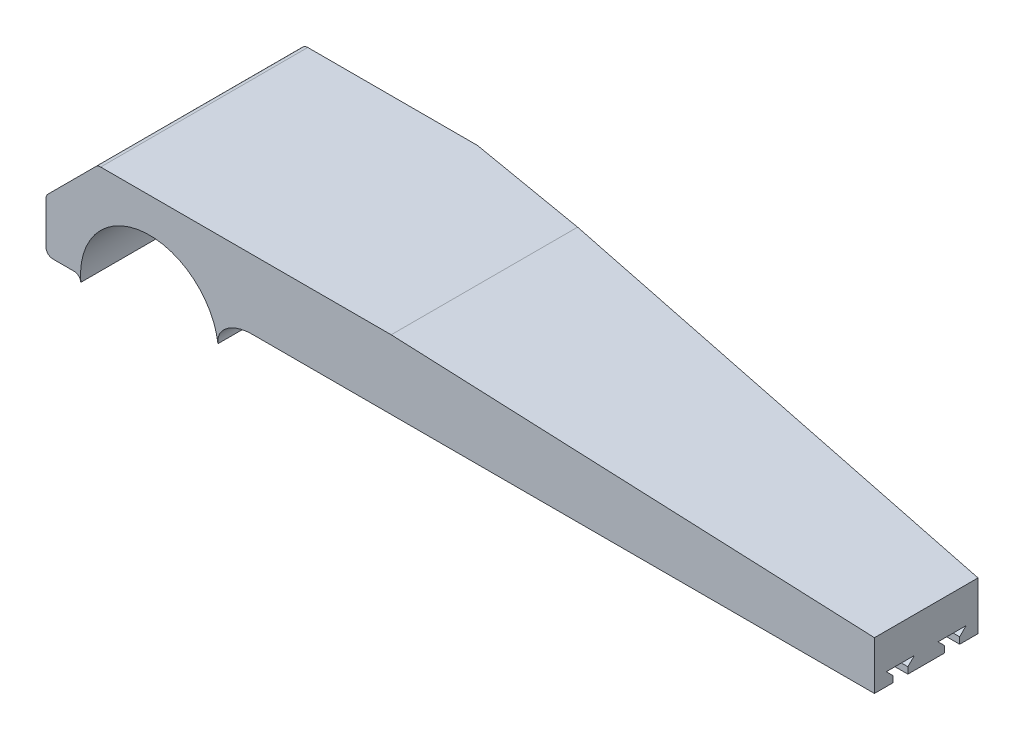
ISO-10303-21;
HEADER;
FILE_DESCRIPTION(('STEP AP214'),'2;1');
FILE_NAME('part.step','',(''),(''),'','','');
FILE_SCHEMA(('AUTOMOTIVE_DESIGN { 1 0 10303 214 1 1 1 1 }'));
ENDSEC;
DATA;
#1=APPLICATION_CONTEXT('core data for automotive mechanical design processes');
#2=APPLICATION_PROTOCOL_DEFINITION('international standard','automotive_design',2000,#1);
#3=PRODUCT_CONTEXT('',#1,'mechanical');
#4=PRODUCT('Part','Part','',(#3));
#5=PRODUCT_RELATED_PRODUCT_CATEGORY('part','',(#4));
#6=PRODUCT_DEFINITION_FORMATION('','',#4);
#7=PRODUCT_DEFINITION_CONTEXT('part definition',#1,'design');
#8=PRODUCT_DEFINITION('design','',#6,#7);
#9=PRODUCT_DEFINITION_SHAPE('','',#8);
#10=(LENGTH_UNIT() NAMED_UNIT(*) SI_UNIT(.MILLI.,.METRE.));
#11=(NAMED_UNIT(*) PLANE_ANGLE_UNIT() SI_UNIT($,.RADIAN.));
#12=(NAMED_UNIT(*) SI_UNIT($,.STERADIAN.) SOLID_ANGLE_UNIT());
#13=UNCERTAINTY_MEASURE_WITH_UNIT(LENGTH_MEASURE(1.E-05),#10,'distance_accuracy_value','');
#14=(GEOMETRIC_REPRESENTATION_CONTEXT(3) GLOBAL_UNCERTAINTY_ASSIGNED_CONTEXT((#13)) GLOBAL_UNIT_ASSIGNED_CONTEXT((#10,
#11,#12)) REPRESENTATION_CONTEXT('',''));
#15=CARTESIAN_POINT('',(0.,0.,0.));
#16=DIRECTION('',(0.,0.,1.));
#17=DIRECTION('',(1.,0.,0.));
#18=AXIS2_PLACEMENT_3D('',#15,#16,#17);
#19=CARTESIAN_POINT('',(130.584621174782,33.1760252329142,596.785052486104));
#20=DIRECTION('',(0.,0.,1.));
#21=DIRECTION('',(1.,0.,0.));
#22=AXIS2_PLACEMENT_3D('',#19,#20,#21);
#23=PLANE('',#22);
#24=CARTESIAN_POINT('',(130.584621174782,33.1760252329142,596.785052486104));
#25=DIRECTION('',(0.,0.,1.));
#26=DIRECTION('',(1.,0.,0.));
#27=AXIS2_PLACEMENT_3D('',#24,#25,#26);
#28=CIRCLE('',#27,160.);
#29=CARTESIAN_POINT('',(289.156021146179,54.5093585662475,596.785052486104));
#30=VERTEX_POINT('',#29);
#31=CARTESIAN_POINT('',(-28.7528500994485,18.6305706874597,596.785052486104));
#32=VERTEX_POINT('',#31);
#33=EDGE_CURVE('E227',#30,#32,#28,.T.);
#34=ORIENTED_EDGE('',*,*,#33,.F.);
#35=CARTESIAN_POINT('',(368.441721131878,113.176025232914,596.785052486104));
#36=CARTESIAN_POINT('',(281.263327029956,113.176025232914,596.785052486104));
#37=CARTESIAN_POINT('',(289.156021146179,54.5093585662475,596.785052486104));
#38=(BOUNDED_CURVE() B_SPLINE_CURVE(2,(#35,#36,#37),.UNSPECIFIED.,.F.,
.F.) B_SPLINE_CURVE_WITH_KNOTS((3,3),(0.,1.),
.UNSPECIFIED.) CURVE() GEOMETRIC_REPRESENTATION_ITEM() RATIONAL_B_SPLINE_CURVE((1.,
0.658280588604383,1.)) REPRESENTATION_ITEM(''));
#39=CARTESIAN_POINT('',(368.441721131878,113.176025232914,596.785052486104));
#40=VERTEX_POINT('',#39);
#41=EDGE_CURVE('E242',#30,#40,#38,.F.);
#42=ORIENTED_EDGE('',*,*,#41,.T.);
#43=DIRECTION('',(1.,0.,0.));
#44=VECTOR('',#43,1.);
#45=CARTESIAN_POINT('',(269.148685780292,113.176025232914,596.785052486104));
#46=LINE('',#45,#44);
#47=CARTESIAN_POINT('',(1810.58462117478,113.176025232914,596.785052486104));
#48=VERTEX_POINT('',#47);
#49=EDGE_CURVE('E386',#40,#48,#46,.T.);
#50=ORIENTED_EDGE('',*,*,#49,.T.);
#51=DIRECTION('',(0.,1.,0.));
#52=VECTOR('',#51,1.);
#53=CARTESIAN_POINT('',(1810.58462117478,113.176025232914,596.785052486104));
#54=LINE('',#53,#52);
#55=CARTESIAN_POINT('',(1810.58462117478,225.176025232914,596.785052486104));
#56=VERTEX_POINT('',#55);
#57=EDGE_CURVE('E389',#48,#56,#54,.T.);
#58=ORIENTED_EDGE('',*,*,#57,.T.);
#59=DIRECTION('',(0.99908289581767,-0.0428178383921858,0.));
#60=VECTOR('',#59,1.);
#61=CARTESIAN_POINT('',(1810.58462117478,225.176025232914,596.785052486104));
#62=LINE('',#61,#60);
#63=CARTESIAN_POINT('',(690.584621174782,273.176025232914,596.785052486104));
#64=VERTEX_POINT('',#63);
#65=EDGE_CURVE('E475',#64,#56,#62,.T.);
#66=ORIENTED_EDGE('',*,*,#65,.F.);
#67=DIRECTION('',(-1.,0.,0.));
#68=VECTOR('',#67,1.);
#69=CARTESIAN_POINT('',(10.5846211747816,273.176025232914,596.785052486104));
#70=LINE('',#69,#68);
#71=CARTESIAN_POINT('',(17.2120381727512,273.176025232914,596.785052486104));
#72=VERTEX_POINT('',#71);
#73=EDGE_CURVE('E399',#64,#72,#70,.T.);
#74=ORIENTED_EDGE('',*,*,#73,.T.);
#75=CARTESIAN_POINT('',(17.2120381727512,257.176025232914,596.785052486104));
#76=DIRECTION('',(0.,0.,1.));
#77=DIRECTION('',(1.,0.,0.));
#78=AXIS2_PLACEMENT_3D('',#75,#76,#77);
#79=CIRCLE('',#78,16.);
#80=CARTESIAN_POINT('',(5.89832967376642,268.489733731899,596.785052486104));
#81=VERTEX_POINT('',#80);
#82=EDGE_CURVE('E330',#72,#81,#79,.T.);
#83=ORIENTED_EDGE('',*,*,#82,.T.);
#84=DIRECTION('',(-0.707106781186548,-0.707106781186548,0.));
#85=VECTOR('',#84,1.);
#86=CARTESIAN_POINT('',(-109.415378825218,153.176025232914,596.785052486104));
#87=LINE('',#86,#85);
#88=CARTESIAN_POINT('',(-104.729087324203,157.862316733929,596.785052486104));
#89=VERTEX_POINT('',#88);
#90=EDGE_CURVE('E372',#81,#89,#87,.T.);
#91=ORIENTED_EDGE('',*,*,#90,.T.);
#92=CARTESIAN_POINT('',(-93.4153788252184,146.548608234945,596.785052486104));
#93=DIRECTION('',(0.,0.,1.));
#94=DIRECTION('',(1.,0.,0.));
#95=AXIS2_PLACEMENT_3D('',#92,#93,#94);
#96=CIRCLE('',#95,16.);
#97=CARTESIAN_POINT('',(-109.415378825218,146.548608234945,596.785052486104));
#98=VERTEX_POINT('',#97);
#99=EDGE_CURVE('E328',#89,#98,#96,.T.);
#100=ORIENTED_EDGE('',*,*,#99,.T.);
#101=DIRECTION('',(0.,-1.,0.));
#102=VECTOR('',#101,1.);
#103=CARTESIAN_POINT('',(-109.415378825218,33.1760252329142,596.785052486104));
#104=LINE('',#103,#102);
#105=CARTESIAN_POINT('',(-109.415378825218,49.1760252329142,596.785052486104));
#106=VERTEX_POINT('',#105);
#107=EDGE_CURVE('E370',#98,#106,#104,.T.);
#108=ORIENTED_EDGE('',*,*,#107,.T.);
#109=CARTESIAN_POINT('',(-93.4153788252184,49.1760252329142,596.785052486104));
#110=DIRECTION('',(0.,0.,1.));
#111=DIRECTION('',(1.,0.,0.));
#112=AXIS2_PLACEMENT_3D('',#109,#110,#111);
#113=CIRCLE('',#112,16.);
#114=CARTESIAN_POINT('',(-93.4153788252184,33.1760252329142,596.785052486104));
#115=VERTEX_POINT('',#114);
#116=EDGE_CURVE('E326',#106,#115,#113,.T.);
#117=ORIENTED_EDGE('',*,*,#116,.T.);
#118=DIRECTION('',(1.,0.,0.));
#119=VECTOR('',#118,1.);
#120=CARTESIAN_POINT('',(-29.4153788252184,33.1760252329142,596.785052486104));
#121=LINE('',#120,#119);
#122=CARTESIAN_POINT('',(-44.6865972268715,33.1760252329142,596.785052486104));
#123=VERTEX_POINT('',#122);
#124=EDGE_CURVE('E320',#115,#123,#121,.T.);
#125=ORIENTED_EDGE('',*,*,#124,.T.);
#126=CARTESIAN_POINT('',(-44.6865972268715,17.1760252329142,596.785052486104));
#127=DIRECTION('',(0.,0.,1.));
#128=DIRECTION('',(1.,0.,0.));
#129=AXIS2_PLACEMENT_3D('',#126,#127,#128);
#130=CIRCLE('',#129,16.);
#131=EDGE_CURVE('E56',#123,#32,#130,.F.);
#132=ORIENTED_EDGE('',*,*,#131,.T.);
#133=EDGE_LOOP('',(#34,#42,#50,#58,#66,#74,#83,#91,#100,#108,#117,#125,#132));
#134=FACE_BOUND('',#133,.T.);
#135=ADVANCED_FACE('F48',(#134),#23,.T.);
#136=CARTESIAN_POINT('',(-29.4153788252184,33.1760252329142,116.785052486104));
#137=DIRECTION('',(0.,-1.,0.));
#138=DIRECTION('',(1.,0.,0.));
#139=AXIS2_PLACEMENT_3D('',#136,#137,#138);
#140=PLANE('',#139);
#141=DIRECTION('',(1.,0.,0.));
#142=VECTOR('',#141,1.);
#143=CARTESIAN_POINT('',(-29.4153788252184,33.1760252329142,116.785052486104));
#144=LINE('',#143,#142);
#145=CARTESIAN_POINT('',(-93.4153788252184,33.1760252329142,116.785052486104));
#146=VERTEX_POINT('',#145);
#147=CARTESIAN_POINT('',(-44.6865972268715,33.1760252329142,116.785052486104));
#148=VERTEX_POINT('',#147);
#149=EDGE_CURVE('E368',#146,#148,#144,.T.);
#150=ORIENTED_EDGE('',*,*,#149,.T.);
#151=DIRECTION('',(0.,0.,-1.));
#152=VECTOR('',#151,1.);
#153=CARTESIAN_POINT('',(-44.6865972268715,33.1760252329142,116.785052486104));
#154=LINE('',#153,#152);
#155=EDGE_CURVE('E350',#148,#123,#154,.F.);
#156=ORIENTED_EDGE('',*,*,#155,.T.);
#157=ORIENTED_EDGE('',*,*,#124,.F.);
#158=DIRECTION('',(0.,0.,1.));
#159=VECTOR('',#158,1.);
#160=CARTESIAN_POINT('',(-93.4153788252184,33.1760252329142,116.785052486104));
#161=LINE('',#160,#159);
#162=EDGE_CURVE('E348',#115,#146,#161,.F.);
#163=ORIENTED_EDGE('',*,*,#162,.T.);
#164=EDGE_LOOP('',(#150,#156,#157,#163));
#165=FACE_BOUND('',#164,.T.);
#166=ADVANCED_FACE('F366',(#165),#140,.T.);
#167=CARTESIAN_POINT('',(-109.415378825218,33.1760252329142,116.785052486104));
#168=DIRECTION('',(-1.,0.,0.));
#169=DIRECTION('',(0.,0.,1.));
#170=AXIS2_PLACEMENT_3D('',#167,#168,#169);
#171=PLANE('',#170);
#172=ORIENTED_EDGE('',*,*,#107,.F.);
#173=DIRECTION('',(0.,0.,1.));
#174=VECTOR('',#173,1.);
#175=CARTESIAN_POINT('',(-109.415378825218,146.548608234945,116.785052486104));
#176=LINE('',#175,#174);
#177=CARTESIAN_POINT('',(-109.415378825218,146.548608234945,116.785052486104));
#178=VERTEX_POINT('',#177);
#179=EDGE_CURVE('E346',#98,#178,#176,.F.);
#180=ORIENTED_EDGE('',*,*,#179,.T.);
#181=DIRECTION('',(0.,-1.,0.));
#182=VECTOR('',#181,1.);
#183=CARTESIAN_POINT('',(-109.415378825218,33.1760252329142,116.785052486104));
#184=LINE('',#183,#182);
#185=CARTESIAN_POINT('',(-109.415378825218,49.1760252329142,116.785052486104));
#186=VERTEX_POINT('',#185);
#187=EDGE_CURVE('E423',#178,#186,#184,.T.);
#188=ORIENTED_EDGE('',*,*,#187,.T.);
#189=DIRECTION('',(0.,0.,1.));
#190=VECTOR('',#189,1.);
#191=CARTESIAN_POINT('',(-109.415378825218,49.1760252329142,116.785052486104));
#192=LINE('',#191,#190);
#193=EDGE_CURVE('E343',#186,#106,#192,.T.);
#194=ORIENTED_EDGE('',*,*,#193,.T.);
#195=EDGE_LOOP('',(#172,#180,#188,#194));
#196=FACE_BOUND('',#195,.T.);
#197=ADVANCED_FACE('F553',(#196),#171,.T.);
#198=CARTESIAN_POINT('',(-109.415378825218,153.176025232914,116.785052486104));
#199=DIRECTION('',(-0.707106781186548,0.707106781186548,0.));
#200=DIRECTION('',(-0.707106781186548,-0.707106781186548,0.));
#201=AXIS2_PLACEMENT_3D('',#198,#199,#200);
#202=PLANE('',#201);
#203=ORIENTED_EDGE('',*,*,#90,.F.);
#204=DIRECTION('',(0.,0.,1.));
#205=VECTOR('',#204,1.);
#206=CARTESIAN_POINT('',(5.89832967376638,268.489733731899,116.785052486104));
#207=LINE('',#206,#205);
#208=CARTESIAN_POINT('',(5.89832967376642,268.489733731899,116.785052486104));
#209=VERTEX_POINT('',#208);
#210=EDGE_CURVE('E335',#81,#209,#207,.F.);
#211=ORIENTED_EDGE('',*,*,#210,.T.);
#212=DIRECTION('',(-0.707106781186548,-0.707106781186548,0.));
#213=VECTOR('',#212,1.);
#214=CARTESIAN_POINT('',(-109.415378825218,153.176025232914,116.785052486104));
#215=LINE('',#214,#213);
#216=CARTESIAN_POINT('',(-104.729087324203,157.862316733929,116.785052486104));
#217=VERTEX_POINT('',#216);
#218=EDGE_CURVE('E415',#209,#217,#215,.T.);
#219=ORIENTED_EDGE('',*,*,#218,.T.);
#220=DIRECTION('',(0.,0.,1.));
#221=VECTOR('',#220,1.);
#222=CARTESIAN_POINT('',(-104.729087324203,157.862316733929,116.785052486104));
#223=LINE('',#222,#221);
#224=EDGE_CURVE('E332',#217,#89,#223,.T.);
#225=ORIENTED_EDGE('',*,*,#224,.T.);
#226=EDGE_LOOP('',(#203,#211,#219,#225));
#227=FACE_BOUND('',#226,.T.);
#228=ADVANCED_FACE('F406',(#227),#202,.T.);
#229=CARTESIAN_POINT('',(10.5846211747816,273.176025232914,116.785052486104));
#230=DIRECTION('',(0.,1.,0.));
#231=DIRECTION('',(0.,0.,1.));
#232=AXIS2_PLACEMENT_3D('',#229,#230,#231);
#233=PLANE('',#232);
#234=DIRECTION('',(-1.,0.,0.));
#235=VECTOR('',#234,1.);
#236=CARTESIAN_POINT('',(10.5846211747816,273.176025232914,116.785052486104));
#237=LINE('',#236,#235);
#238=CARTESIAN_POINT('',(410.584621174782,273.176025232914,116.785052486104));
#239=VERTEX_POINT('',#238);
#240=CARTESIAN_POINT('',(17.2120381727512,273.176025232914,116.785052486104));
#241=VERTEX_POINT('',#240);
#242=EDGE_CURVE('E414',#239,#241,#237,.T.);
#243=ORIENTED_EDGE('',*,*,#242,.T.);
#244=DIRECTION('',(0.,0.,1.));
#245=VECTOR('',#244,1.);
#246=CARTESIAN_POINT('',(17.2120381727512,273.176025232914,116.785052486104));
#247=LINE('',#246,#245);
#248=EDGE_CURVE('E323',#241,#72,#247,.T.);
#249=ORIENTED_EDGE('',*,*,#248,.T.);
#250=ORIENTED_EDGE('',*,*,#73,.F.);
#251=DIRECTION('',(0.,0.,1.));
#252=VECTOR('',#251,1.);
#253=CARTESIAN_POINT('',(690.584621174782,273.176025232914,76.7850524861044));
#254=LINE('',#253,#252);
#255=CARTESIAN_POINT('',(690.584621174782,273.176025232914,164.785052486104));
#256=VERTEX_POINT('',#255);
#257=EDGE_CURVE('E521',#256,#64,#254,.T.);
#258=ORIENTED_EDGE('',*,*,#257,.F.);
#259=DIRECTION('',(0.985622254813267,0.,0.168963815110846));
#260=VECTOR('',#259,1.);
#261=CARTESIAN_POINT('',(22.0041295015065,273.176025232914,50.1712539135429));
#262=LINE('',#261,#260);
#263=EDGE_CURVE('E390',#239,#256,#262,.T.);
#264=ORIENTED_EDGE('',*,*,#263,.F.);
#265=EDGE_LOOP('',(#243,#249,#250,#258,#264));
#266=FACE_BOUND('',#265,.T.);
#267=ADVANCED_FACE('F418',(#266),#233,.T.);
#268=CARTESIAN_POINT('',(1810.58462117478,113.176025232914,116.785052486104));
#269=DIRECTION('',(1.,0.,0.));
#270=DIRECTION('',(0.,0.,-1.));
#271=AXIS2_PLACEMENT_3D('',#268,#269,#270);
#272=PLANE('',#271);
#273=DIRECTION('',(0.,-1.,0.));
#274=VECTOR('',#273,1.);
#275=CARTESIAN_POINT('',(1810.58462117478,113.176025232914,554.285052486104));
#276=LINE('',#275,#274);
#277=CARTESIAN_POINT('',(1810.58462117478,128.176025232914,554.285052486104));
#278=VERTEX_POINT('',#277);
#279=CARTESIAN_POINT('',(1810.58462117478,113.176025232914,554.285052486104));
#280=VERTEX_POINT('',#279);
#281=EDGE_CURVE('E470',#278,#280,#276,.T.);
#282=ORIENTED_EDGE('',*,*,#281,.F.);
#283=DIRECTION('',(0.,-0.707106781186548,-0.707106781186548));
#284=VECTOR('',#283,1.);
#285=CARTESIAN_POINT('',(1810.58462117478,128.176025232914,554.285052486104));
#286=LINE('',#285,#284);
#287=CARTESIAN_POINT('',(1810.58462117478,143.176025232914,569.285052486104));
#288=VERTEX_POINT('',#287);
#289=EDGE_CURVE('E467',#288,#278,#286,.T.);
#290=ORIENTED_EDGE('',*,*,#289,.F.);
#291=DIRECTION('',(0.,0.,1.));
#292=VECTOR('',#291,1.);
#293=CARTESIAN_POINT('',(1810.58462117478,143.176025232914,569.285052486104));
#294=LINE('',#293,#292);
#295=CARTESIAN_POINT('',(1810.58462117478,143.176025232914,504.285052486104));
#296=VERTEX_POINT('',#295);
#297=EDGE_CURVE('E458',#296,#288,#294,.T.);
#298=ORIENTED_EDGE('',*,*,#297,.F.);
#299=DIRECTION('',(0.,0.707106781186548,-0.707106781186548));
#300=VECTOR('',#299,1.);
#301=CARTESIAN_POINT('',(1810.58462117478,143.176025232914,504.285052486104));
#302=LINE('',#301,#300);
#303=CARTESIAN_POINT('',(1810.58462117478,128.176025232914,519.285052486104));
#304=VERTEX_POINT('',#303);
#305=EDGE_CURVE('E455',#304,#296,#302,.T.);
#306=ORIENTED_EDGE('',*,*,#305,.F.);
#307=DIRECTION('',(0.,1.,0.));
#308=VECTOR('',#307,1.);
#309=CARTESIAN_POINT('',(1810.58462117478,128.176025232914,519.285052486104));
#310=LINE('',#309,#308);
#311=CARTESIAN_POINT('',(1810.58462117478,113.176025232914,519.285052486104));
#312=VERTEX_POINT('',#311);
#313=EDGE_CURVE('E452',#312,#304,#310,.T.);
#314=ORIENTED_EDGE('',*,*,#313,.F.);
#315=DIRECTION('',(0.,0.,1.));
#316=VECTOR('',#315,1.);
#317=CARTESIAN_POINT('',(1810.58462117478,113.176025232914,116.785052486104));
#318=LINE('',#317,#316);
#319=CARTESIAN_POINT('',(1810.58462117478,113.176025232914,434.285052486104));
#320=VERTEX_POINT('',#319);
#321=EDGE_CURVE('E380',#320,#312,#318,.T.);
#322=ORIENTED_EDGE('',*,*,#321,.F.);
#323=DIRECTION('',(0.,-1.,0.));
#324=VECTOR('',#323,1.);
#325=CARTESIAN_POINT('',(1810.58462117478,128.176025232914,434.285052486104));
#326=LINE('',#325,#324);
#327=CARTESIAN_POINT('',(1810.58462117478,128.176025232914,434.285052486104));
#328=VERTEX_POINT('',#327);
#329=EDGE_CURVE('E449',#328,#320,#326,.T.);
#330=ORIENTED_EDGE('',*,*,#329,.F.);
#331=DIRECTION('',(0.,-0.707106781186548,-0.707106781186548));
#332=VECTOR('',#331,1.);
#333=CARTESIAN_POINT('',(1810.58462117478,143.176025232914,449.285052486104));
#334=LINE('',#333,#332);
#335=CARTESIAN_POINT('',(1810.58462117478,143.176025232914,449.285052486104));
#336=VERTEX_POINT('',#335);
#337=EDGE_CURVE('E496',#336,#328,#334,.T.);
#338=ORIENTED_EDGE('',*,*,#337,.F.);
#339=DIRECTION('',(0.,0.,1.));
#340=VECTOR('',#339,1.);
#341=CARTESIAN_POINT('',(1810.58462117478,143.176025232914,384.285052486104));
#342=LINE('',#341,#340);
#343=CARTESIAN_POINT('',(1810.58462117478,143.176025232914,384.285052486104));
#344=VERTEX_POINT('',#343);
#345=EDGE_CURVE('E499',#344,#336,#342,.T.);
#346=ORIENTED_EDGE('',*,*,#345,.F.);
#347=DIRECTION('',(0.,0.707106781186548,-0.707106781186548));
#348=VECTOR('',#347,1.);
#349=CARTESIAN_POINT('',(1810.58462117478,128.176025232914,399.285052486104));
#350=LINE('',#349,#348);
#351=CARTESIAN_POINT('',(1810.58462117478,128.176025232914,399.285052486104));
#352=VERTEX_POINT('',#351);
#353=EDGE_CURVE('E502',#352,#344,#350,.T.);
#354=ORIENTED_EDGE('',*,*,#353,.F.);
#355=DIRECTION('',(0.,1.,0.));
#356=VECTOR('',#355,1.);
#357=CARTESIAN_POINT('',(1810.58462117478,113.176025232914,399.285052486104));
#358=LINE('',#357,#356);
#359=CARTESIAN_POINT('',(1810.58462117478,113.176025232914,399.285052486104));
#360=VERTEX_POINT('',#359);
#361=EDGE_CURVE('E460',#360,#352,#358,.T.);
#362=ORIENTED_EDGE('',*,*,#361,.F.);
#363=CARTESIAN_POINT('',(1810.58462117478,113.176025232914,356.785052486104));
#364=VERTEX_POINT('',#363);
#365=EDGE_CURVE('E376',#364,#360,#318,.T.);
#366=ORIENTED_EDGE('',*,*,#365,.F.);
#367=DIRECTION('',(0.,-1.,0.));
#368=VECTOR('',#367,1.);
#369=CARTESIAN_POINT('',(1810.58462117478,593.176025232914,356.785052486104));
#370=LINE('',#369,#368);
#371=CARTESIAN_POINT('',(1810.58462117478,225.176025232914,356.785052486104));
#372=VERTEX_POINT('',#371);
#373=EDGE_CURVE('E529',#372,#364,#370,.T.);
#374=ORIENTED_EDGE('',*,*,#373,.F.);
#375=DIRECTION('',(0.,0.,1.));
#376=VECTOR('',#375,1.);
#377=CARTESIAN_POINT('',(1810.58462117478,225.176025232914,76.7850524861044));
#378=LINE('',#377,#376);
#379=EDGE_CURVE('E522',#372,#56,#378,.T.);
#380=ORIENTED_EDGE('',*,*,#379,.T.);
#381=ORIENTED_EDGE('',*,*,#57,.F.);
#382=EDGE_CURVE('E381',#280,#48,#318,.T.);
#383=ORIENTED_EDGE('',*,*,#382,.F.);
#384=EDGE_LOOP('',(#282,#290,#298,#306,#314,#322,#330,#338,#346,#354,#362,#366,#374,#380,#381,#383));
#385=FACE_BOUND('',#384,.T.);
#386=ADVANCED_FACE('F447',(#385),#272,.T.);
#387=CARTESIAN_POINT('',(269.148685780292,113.176025232914,116.785052486104));
#388=DIRECTION('',(0.,-1.,0.));
#389=DIRECTION('',(1.,0.,0.));
#390=AXIS2_PLACEMENT_3D('',#387,#388,#389);
#391=PLANE('',#390);
#392=DIRECTION('',(1.,0.,0.));
#393=VECTOR('',#392,1.);
#394=CARTESIAN_POINT('',(410.584621174782,113.176025232914,554.285052486104));
#395=LINE('',#394,#393);
#396=CARTESIAN_POINT('',(410.584621174782,113.176025232914,554.285052486104));
#397=VERTEX_POINT('',#396);
#398=EDGE_CURVE('E473',#397,#280,#395,.T.);
#399=ORIENTED_EDGE('',*,*,#398,.T.);
#400=ORIENTED_EDGE('',*,*,#382,.T.);
#401=ORIENTED_EDGE('',*,*,#49,.F.);
#402=CARTESIAN_POINT('',(368.441721131878,113.176025232914,92.7850524861043));
#403=CARTESIAN_POINT('',(368.441721131878,113.176025232914,268.785052486104));
#404=CARTESIAN_POINT('',(368.441721131878,113.176025232914,444.785052486105));
#405=CARTESIAN_POINT('',(368.441721131878,113.176025232914,620.785052486105));
#406=(BOUNDED_CURVE() B_SPLINE_CURVE(3,(#402,#403,#404,#405),.UNSPECIFIED.,.F.,
.F.) B_SPLINE_CURVE_WITH_KNOTS((4,4),(-0.03,0.63),
.UNSPECIFIED.) CURVE() GEOMETRIC_REPRESENTATION_ITEM() RATIONAL_B_SPLINE_CURVE((1.,1.,1.,1.)) REPRESENTATION_ITEM(''));
#407=CARTESIAN_POINT('',(368.441721131878,113.176025232914,116.785052486104));
#408=VERTEX_POINT('',#407);
#409=EDGE_CURVE('E236',#40,#408,#406,.F.);
#410=ORIENTED_EDGE('',*,*,#409,.T.);
#411=DIRECTION('',(1.,0.,0.));
#412=VECTOR('',#411,1.);
#413=CARTESIAN_POINT('',(269.148685780292,113.176025232914,116.785052486104));
#414=LINE('',#413,#412);
#415=CARTESIAN_POINT('',(410.584621174782,113.176025232914,116.785052486104));
#416=VERTEX_POINT('',#415);
#417=EDGE_CURVE('E319',#408,#416,#414,.T.);
#418=ORIENTED_EDGE('',*,*,#417,.T.);
#419=DIRECTION('',(-0.985622254813267,0.,-0.168963815110846));
#420=VECTOR('',#419,1.);
#421=CARTESIAN_POINT('',(410.584621174782,113.176025232914,116.785052486104));
#422=LINE('',#421,#420);
#423=EDGE_CURVE('E525',#364,#416,#422,.T.);
#424=ORIENTED_EDGE('',*,*,#423,.F.);
#425=ORIENTED_EDGE('',*,*,#365,.T.);
#426=DIRECTION('',(1.,0.,0.));
#427=VECTOR('',#426,1.);
#428=CARTESIAN_POINT('',(410.584621174782,113.176025232914,399.285052486104));
#429=LINE('',#428,#427);
#430=CARTESIAN_POINT('',(410.584621174782,113.176025232914,399.285052486104));
#431=VERTEX_POINT('',#430);
#432=EDGE_CURVE('E487',#431,#360,#429,.T.);
#433=ORIENTED_EDGE('',*,*,#432,.F.);
#434=DIRECTION('',(0.,0.,-1.));
#435=VECTOR('',#434,1.);
#436=CARTESIAN_POINT('',(410.584621174782,113.176025232914,434.285052486104));
#437=LINE('',#436,#435);
#438=CARTESIAN_POINT('',(410.584621174782,113.176025232914,434.285052486104));
#439=VERTEX_POINT('',#438);
#440=EDGE_CURVE('E517',#439,#431,#437,.T.);
#441=ORIENTED_EDGE('',*,*,#440,.F.);
#442=DIRECTION('',(1.,0.,0.));
#443=VECTOR('',#442,1.);
#444=CARTESIAN_POINT('',(410.584621174782,113.176025232914,434.285052486104));
#445=LINE('',#444,#443);
#446=EDGE_CURVE('E442',#439,#320,#445,.T.);
#447=ORIENTED_EDGE('',*,*,#446,.T.);
#448=ORIENTED_EDGE('',*,*,#321,.T.);
#449=DIRECTION('',(1.,0.,0.));
#450=VECTOR('',#449,1.);
#451=CARTESIAN_POINT('',(410.584621174782,113.176025232914,519.285052486104));
#452=LINE('',#451,#450);
#453=CARTESIAN_POINT('',(410.584621174782,113.176025232914,519.285052486104));
#454=VERTEX_POINT('',#453);
#455=EDGE_CURVE('E440',#454,#312,#452,.T.);
#456=ORIENTED_EDGE('',*,*,#455,.F.);
#457=DIRECTION('',(0.,0.,-1.));
#458=VECTOR('',#457,1.);
#459=CARTESIAN_POINT('',(410.584621174782,113.176025232914,519.285052486104));
#460=LINE('',#459,#458);
#461=EDGE_CURVE('E472',#397,#454,#460,.T.);
#462=ORIENTED_EDGE('',*,*,#461,.F.);
#463=EDGE_LOOP('',(#399,#400,#401,#410,#418,#424,#425,#433,#441,#447,#448,#456,#462));
#464=FACE_BOUND('',#463,.T.);
#465=ADVANCED_FACE('F438',(#464),#391,.T.);
#466=CARTESIAN_POINT('',(130.584621174782,33.1760252329142,116.785052486104));
#467=DIRECTION('',(0.,0.,1.));
#468=DIRECTION('',(1.,0.,0.));
#469=AXIS2_PLACEMENT_3D('',#466,#467,#468);
#470=PLANE('',#469);
#471=ORIENTED_EDGE('',*,*,#218,.F.);
#472=CARTESIAN_POINT('',(17.2120381727512,257.176025232914,116.785052486104));
#473=DIRECTION('',(0.,0.,1.));
#474=DIRECTION('',(1.,0.,0.));
#475=AXIS2_PLACEMENT_3D('',#472,#473,#474);
#476=CIRCLE('',#475,16.);
#477=EDGE_CURVE('E341',#209,#241,#476,.F.);
#478=ORIENTED_EDGE('',*,*,#477,.T.);
#479=ORIENTED_EDGE('',*,*,#242,.F.);
#480=DIRECTION('',(0.,-1.,0.));
#481=VECTOR('',#480,1.);
#482=CARTESIAN_POINT('',(410.584621174782,33.1760252329142,116.785052486104));
#483=LINE('',#482,#481);
#484=EDGE_CURVE('E379',#239,#416,#483,.T.);
#485=ORIENTED_EDGE('',*,*,#484,.T.);
#486=ORIENTED_EDGE('',*,*,#417,.F.);
#487=CARTESIAN_POINT('',(289.156021146179,54.5093585662476,116.785052486104));
#488=CARTESIAN_POINT('',(281.263327029956,113.176025232914,116.785052486104));
#489=CARTESIAN_POINT('',(368.441721131878,113.176025232914,116.785052486104));
#490=(BOUNDED_CURVE() B_SPLINE_CURVE(2,(#487,#488,#489),.UNSPECIFIED.,.F.,
.F.) B_SPLINE_CURVE_WITH_KNOTS((3,3),(0.,1.),
.UNSPECIFIED.) CURVE() GEOMETRIC_REPRESENTATION_ITEM() RATIONAL_B_SPLINE_CURVE((1.,
0.658280588604383,1.)) REPRESENTATION_ITEM(''));
#491=CARTESIAN_POINT('',(289.156021146179,54.5093585662476,116.785052486104));
#492=VERTEX_POINT('',#491);
#493=EDGE_CURVE('E253',#408,#492,#490,.F.);
#494=ORIENTED_EDGE('',*,*,#493,.T.);
#495=CARTESIAN_POINT('',(130.584621174782,33.1760252329142,116.785052486104));
#496=DIRECTION('',(0.,0.,-1.));
#497=DIRECTION('',(1.,0.,0.));
#498=AXIS2_PLACEMENT_3D('',#495,#496,#497);
#499=CIRCLE('',#498,160.);
#500=CARTESIAN_POINT('',(-28.7528500994485,18.6305706874597,116.785052486104));
#501=VERTEX_POINT('',#500);
#502=EDGE_CURVE('E230',#501,#492,#499,.T.);
#503=ORIENTED_EDGE('',*,*,#502,.F.);
#504=CARTESIAN_POINT('',(-44.6865972268715,17.1760252329142,116.785052486104));
#505=DIRECTION('',(0.,0.,1.));
#506=DIRECTION('',(1.,0.,0.));
#507=AXIS2_PLACEMENT_3D('',#504,#505,#506);
#508=CIRCLE('',#507,16.);
#509=EDGE_CURVE('E12',#501,#148,#508,.T.);
#510=ORIENTED_EDGE('',*,*,#509,.T.);
#511=ORIENTED_EDGE('',*,*,#149,.F.);
#512=CARTESIAN_POINT('',(-93.4153788252184,49.1760252329142,116.785052486104));
#513=DIRECTION('',(0.,0.,1.));
#514=DIRECTION('',(1.,0.,0.));
#515=AXIS2_PLACEMENT_3D('',#512,#513,#514);
#516=CIRCLE('',#515,16.);
#517=EDGE_CURVE('E337',#146,#186,#516,.F.);
#518=ORIENTED_EDGE('',*,*,#517,.T.);
#519=ORIENTED_EDGE('',*,*,#187,.F.);
#520=CARTESIAN_POINT('',(-93.4153788252184,146.548608234945,116.785052486104));
#521=DIRECTION('',(0.,0.,1.));
#522=DIRECTION('',(1.,0.,0.));
#523=AXIS2_PLACEMENT_3D('',#520,#521,#522);
#524=CIRCLE('',#523,16.);
#525=EDGE_CURVE('E339',#178,#217,#524,.F.);
#526=ORIENTED_EDGE('',*,*,#525,.T.);
#527=EDGE_LOOP('',(#471,#478,#479,#485,#486,#494,#503,#510,#511,#518,#519,#526));
#528=FACE_BOUND('',#527,.T.);
#529=ADVANCED_FACE('F358',(#528),#470,.F.);
#530=CARTESIAN_POINT('',(410.584621174782,593.176025232914,116.785052486104));
#531=DIRECTION('',(-0.168963815110846,0.,0.985622254813267));
#532=DIRECTION('',(0.985622254813267,0.,0.168963815110846));
#533=AXIS2_PLACEMENT_3D('',#530,#531,#532);
#534=PLANE('',#533);
#535=ORIENTED_EDGE('',*,*,#263,.T.);
#536=DIRECTION('',(0.984744107800003,-0.0422033189057144,0.168813275622858));
#537=VECTOR('',#536,1.);
#538=CARTESIAN_POINT('',(397.784304531204,285.724610231925,114.590712490062));
#539=LINE('',#538,#537);
#540=EDGE_CURVE('E237',#256,#372,#539,.T.);
#541=ORIENTED_EDGE('',*,*,#540,.T.);
#542=ORIENTED_EDGE('',*,*,#373,.T.);
#543=ORIENTED_EDGE('',*,*,#423,.T.);
#544=ORIENTED_EDGE('',*,*,#484,.F.);
#545=EDGE_LOOP('',(#535,#541,#542,#543,#544));
#546=FACE_BOUND('',#545,.T.);
#547=ADVANCED_FACE('F531',(#546),#534,.F.);
#548=CARTESIAN_POINT('',(1810.58462117478,225.176025232914,76.7850524861044));
#549=DIRECTION('',(-0.0428178383921858,-0.99908289581767,0.));
#550=DIRECTION('',(0.99908289581767,-0.0428178383921859,0.));
#551=AXIS2_PLACEMENT_3D('',#548,#549,#550);
#552=PLANE('',#551);
#553=ORIENTED_EDGE('',*,*,#257,.T.);
#554=ORIENTED_EDGE('',*,*,#65,.T.);
#555=ORIENTED_EDGE('',*,*,#379,.F.);
#556=ORIENTED_EDGE('',*,*,#540,.F.);
#557=EDGE_LOOP('',(#553,#554,#555,#556));
#558=FACE_BOUND('',#557,.T.);
#559=ADVANCED_FACE('F275',(#558),#552,.F.);
#560=CARTESIAN_POINT('',(368.441721131878,113.176025232914,620.785052486105));
#561=CARTESIAN_POINT('',(368.441721131878,113.176025232914,444.785052486105));
#562=CARTESIAN_POINT('',(368.441721131878,113.176025232914,268.785052486104));
#563=CARTESIAN_POINT('',(368.441721131878,113.176025232914,92.7850524861043));
#564=CARTESIAN_POINT('',(281.263327029956,113.176025232914,620.785052486104));
#565=CARTESIAN_POINT('',(281.263327029956,113.176025232914,444.785052486105));
#566=CARTESIAN_POINT('',(281.263327029956,113.176025232914,268.785052486104));
#567=CARTESIAN_POINT('',(281.263327029956,113.176025232914,92.7850524861043));
#568=CARTESIAN_POINT('',(289.156021146179,54.5093585662476,620.785052486105));
#569=CARTESIAN_POINT('',(289.156021146179,54.5093585662476,444.785052486105));
#570=CARTESIAN_POINT('',(289.156021146179,54.5093585662476,268.785052486104));
#571=CARTESIAN_POINT('',(289.156021146179,54.5093585662476,92.7850524861043));
#572=(BOUNDED_SURFACE() B_SPLINE_SURFACE(2,3,((#560,#561,#562,#563),(#564,#565,#566,#567),(#568,
#569,#570,#571)),.UNSPECIFIED.,.F.,.F.,.F.) B_SPLINE_SURFACE_WITH_KNOTS((3,3),(4,4),(0.,1.),
(-0.03,0.63),.UNSPECIFIED.) GEOMETRIC_REPRESENTATION_ITEM() RATIONAL_B_SPLINE_SURFACE(((1.,1.,
1.,1.),(0.658280588604383,0.658280588604383,0.658280588604383,0.658280588604383),(1.,1.,1.,1.))) REPRESENTATION_ITEM('') SURFACE());
#573=CARTESIAN_POINT('',(289.156021146179,54.5093585662476,620.785052486105));
#574=CARTESIAN_POINT('',(289.156021146179,54.5093585662476,444.785052486105));
#575=CARTESIAN_POINT('',(289.156021146179,54.5093585662476,268.785052486104));
#576=CARTESIAN_POINT('',(289.156021146179,54.5093585662476,92.7850524861043));
#577=(BOUNDED_CURVE() B_SPLINE_CURVE(3,(#573,#574,#575,#576),.UNSPECIFIED.,.F.,
.F.) B_SPLINE_CURVE_WITH_KNOTS((4,4),(-0.03,0.63),
.UNSPECIFIED.) CURVE() GEOMETRIC_REPRESENTATION_ITEM() RATIONAL_B_SPLINE_CURVE((1.,1.,1.,1.)) REPRESENTATION_ITEM(''));
#578=EDGE_CURVE('E223',#492,#30,#577,.F.);
#579=ORIENTED_EDGE('',*,*,#493,.F.);
#580=ORIENTED_EDGE('',*,*,#409,.F.);
#581=ORIENTED_EDGE('',*,*,#41,.F.);
#582=ORIENTED_EDGE('',*,*,#578,.F.);
#583=EDGE_LOOP('',(#579,#580,#581,#582));
#584=FACE_BOUND('',#583,.T.);
#585=ADVANCED_FACE('F251',(#584),#572,.T.);
#586=CARTESIAN_POINT('',(17.2120381727512,257.176025232914,116.785052486104));
#587=DIRECTION('',(0.,0.,1.));
#588=DIRECTION('',(1.,0.,0.));
#589=AXIS2_PLACEMENT_3D('',#586,#587,#588);
#590=CYLINDRICAL_SURFACE('',#589,16.);
#591=ORIENTED_EDGE('',*,*,#477,.F.);
#592=ORIENTED_EDGE('',*,*,#210,.F.);
#593=ORIENTED_EDGE('',*,*,#82,.F.);
#594=ORIENTED_EDGE('',*,*,#248,.F.);
#595=EDGE_LOOP('',(#591,#592,#593,#594));
#596=FACE_BOUND('',#595,.T.);
#597=ADVANCED_FACE('F274',(#596),#590,.T.);
#598=CARTESIAN_POINT('',(-93.4153788252184,146.548608234945,116.785052486104));
#599=DIRECTION('',(0.,0.,1.));
#600=DIRECTION('',(1.,0.,0.));
#601=AXIS2_PLACEMENT_3D('',#598,#599,#600);
#602=CYLINDRICAL_SURFACE('',#601,16.);
#603=ORIENTED_EDGE('',*,*,#525,.F.);
#604=ORIENTED_EDGE('',*,*,#179,.F.);
#605=ORIENTED_EDGE('',*,*,#99,.F.);
#606=ORIENTED_EDGE('',*,*,#224,.F.);
#607=EDGE_LOOP('',(#603,#604,#605,#606));
#608=FACE_BOUND('',#607,.T.);
#609=ADVANCED_FACE('F698',(#608),#602,.T.);
#610=CARTESIAN_POINT('',(-44.6865972268715,17.1760252329142,596.785052486104));
#611=DIRECTION('',(0.,0.,-1.));
#612=DIRECTION('',(-1.,0.,0.));
#613=AXIS2_PLACEMENT_3D('',#610,#611,#612);
#614=CYLINDRICAL_SURFACE('',#613,16.);
#615=ORIENTED_EDGE('',*,*,#509,.F.);
#616=DIRECTION('',(0.,0.,-1.));
#617=VECTOR('',#616,1.);
#618=CARTESIAN_POINT('',(-28.7528500994485,18.6305706874597,596.785052486104));
#619=LINE('',#618,#617);
#620=EDGE_CURVE('E353',#32,#501,#619,.T.);
#621=ORIENTED_EDGE('',*,*,#620,.F.);
#622=ORIENTED_EDGE('',*,*,#131,.F.);
#623=ORIENTED_EDGE('',*,*,#155,.F.);
#624=EDGE_LOOP('',(#615,#621,#622,#623));
#625=FACE_BOUND('',#624,.T.);
#626=ADVANCED_FACE('F363',(#625),#614,.F.);
#627=CARTESIAN_POINT('',(-93.4153788252184,49.1760252329142,116.785052486104));
#628=DIRECTION('',(0.,0.,1.));
#629=DIRECTION('',(1.,0.,0.));
#630=AXIS2_PLACEMENT_3D('',#627,#628,#629);
#631=CYLINDRICAL_SURFACE('',#630,16.);
#632=ORIENTED_EDGE('',*,*,#517,.F.);
#633=ORIENTED_EDGE('',*,*,#162,.F.);
#634=ORIENTED_EDGE('',*,*,#116,.F.);
#635=ORIENTED_EDGE('',*,*,#193,.F.);
#636=EDGE_LOOP('',(#632,#633,#634,#635));
#637=FACE_BOUND('',#636,.T.);
#638=ADVANCED_FACE('F50',(#637),#631,.T.);
#639=CARTESIAN_POINT('',(410.584621174782,128.176025232914,434.285052486104));
#640=DIRECTION('',(0.,0.,1.));
#641=DIRECTION('',(1.,0.,0.));
#642=AXIS2_PLACEMENT_3D('',#639,#640,#641);
#643=PLANE('',#642);
#644=ORIENTED_EDGE('',*,*,#329,.T.);
#645=ORIENTED_EDGE('',*,*,#446,.F.);
#646=DIRECTION('',(0.,-1.,0.));
#647=VECTOR('',#646,1.);
#648=CARTESIAN_POINT('',(410.584621174782,128.176025232914,434.285052486104));
#649=LINE('',#648,#647);
#650=CARTESIAN_POINT('',(410.584621174782,128.176025232914,434.285052486104));
#651=VERTEX_POINT('',#650);
#652=EDGE_CURVE('E71',#651,#439,#649,.T.);
#653=ORIENTED_EDGE('',*,*,#652,.F.);
#654=DIRECTION('',(1.,0.,0.));
#655=VECTOR('',#654,1.);
#656=CARTESIAN_POINT('',(410.584621174782,128.176025232914,434.285052486104));
#657=LINE('',#656,#655);
#658=EDGE_CURVE('E247',#651,#328,#657,.T.);
#659=ORIENTED_EDGE('',*,*,#658,.T.);
#660=EDGE_LOOP('',(#644,#645,#653,#659));
#661=FACE_BOUND('',#660,.T.);
#662=ADVANCED_FACE('F574',(#661),#643,.F.);
#663=CARTESIAN_POINT('',(410.584621174782,143.176025232914,449.285052486104));
#664=DIRECTION('',(0.,-0.707106781186547,0.707106781186547));
#665=DIRECTION('',(0.,-0.707106781186548,-0.707106781186548));
#666=AXIS2_PLACEMENT_3D('',#663,#664,#665);
#667=PLANE('',#666);
#668=ORIENTED_EDGE('',*,*,#337,.T.);
#669=ORIENTED_EDGE('',*,*,#658,.F.);
#670=DIRECTION('',(0.,-0.707106781186548,-0.707106781186548));
#671=VECTOR('',#670,1.);
#672=CARTESIAN_POINT('',(410.584621174782,143.176025232914,449.285052486104));
#673=LINE('',#672,#671);
#674=CARTESIAN_POINT('',(410.584621174782,143.176025232914,449.285052486104));
#675=VERTEX_POINT('',#674);
#676=EDGE_CURVE('E486',#675,#651,#673,.T.);
#677=ORIENTED_EDGE('',*,*,#676,.F.);
#678=DIRECTION('',(1.,0.,0.));
#679=VECTOR('',#678,1.);
#680=CARTESIAN_POINT('',(410.584621174782,143.176025232914,449.285052486104));
#681=LINE('',#680,#679);
#682=EDGE_CURVE('E493',#675,#336,#681,.T.);
#683=ORIENTED_EDGE('',*,*,#682,.T.);
#684=EDGE_LOOP('',(#668,#669,#677,#683));
#685=FACE_BOUND('',#684,.T.);
#686=ADVANCED_FACE('F570',(#685),#667,.F.);
#687=CARTESIAN_POINT('',(410.584621174782,143.176025232914,384.285052486104));
#688=DIRECTION('',(0.,1.,0.));
#689=DIRECTION('',(0.,0.,1.));
#690=AXIS2_PLACEMENT_3D('',#687,#688,#689);
#691=PLANE('',#690);
#692=ORIENTED_EDGE('',*,*,#345,.T.);
#693=ORIENTED_EDGE('',*,*,#682,.F.);
#694=DIRECTION('',(0.,0.,1.));
#695=VECTOR('',#694,1.);
#696=CARTESIAN_POINT('',(410.584621174782,143.176025232914,384.285052486104));
#697=LINE('',#696,#695);
#698=CARTESIAN_POINT('',(410.584621174782,143.176025232914,384.285052486104));
#699=VERTEX_POINT('',#698);
#700=EDGE_CURVE('E508',#699,#675,#697,.T.);
#701=ORIENTED_EDGE('',*,*,#700,.F.);
#702=DIRECTION('',(1.,0.,0.));
#703=VECTOR('',#702,1.);
#704=CARTESIAN_POINT('',(410.584621174782,143.176025232914,384.285052486104));
#705=LINE('',#704,#703);
#706=EDGE_CURVE('E491',#699,#344,#705,.T.);
#707=ORIENTED_EDGE('',*,*,#706,.T.);
#708=EDGE_LOOP('',(#692,#693,#701,#707));
#709=FACE_BOUND('',#708,.T.);
#710=ADVANCED_FACE('F573',(#709),#691,.F.);
#711=CARTESIAN_POINT('',(410.584621174782,128.176025232914,399.285052486104));
#712=DIRECTION('',(0.,-0.707106781186547,-0.707106781186547));
#713=DIRECTION('',(0.,0.707106781186548,-0.707106781186548));
#714=AXIS2_PLACEMENT_3D('',#711,#712,#713);
#715=PLANE('',#714);
#716=ORIENTED_EDGE('',*,*,#353,.T.);
#717=ORIENTED_EDGE('',*,*,#706,.F.);
#718=DIRECTION('',(0.,0.707106781186548,-0.707106781186548));
#719=VECTOR('',#718,1.);
#720=CARTESIAN_POINT('',(410.584621174782,128.176025232914,399.285052486104));
#721=LINE('',#720,#719);
#722=CARTESIAN_POINT('',(410.584621174782,128.176025232914,399.285052486104));
#723=VERTEX_POINT('',#722);
#724=EDGE_CURVE('E511',#723,#699,#721,.T.);
#725=ORIENTED_EDGE('',*,*,#724,.F.);
#726=DIRECTION('',(1.,0.,0.));
#727=VECTOR('',#726,1.);
#728=CARTESIAN_POINT('',(410.584621174782,128.176025232914,399.285052486104));
#729=LINE('',#728,#727);
#730=EDGE_CURVE('E489',#723,#352,#729,.T.);
#731=ORIENTED_EDGE('',*,*,#730,.T.);
#732=EDGE_LOOP('',(#716,#717,#725,#731));
#733=FACE_BOUND('',#732,.T.);
#734=ADVANCED_FACE('F578',(#733),#715,.F.);
#735=CARTESIAN_POINT('',(410.584621174782,113.176025232914,399.285052486104));
#736=DIRECTION('',(0.,0.,-1.));
#737=DIRECTION('',(-1.,0.,0.));
#738=AXIS2_PLACEMENT_3D('',#735,#736,#737);
#739=PLANE('',#738);
#740=ORIENTED_EDGE('',*,*,#361,.T.);
#741=ORIENTED_EDGE('',*,*,#730,.F.);
#742=DIRECTION('',(0.,1.,0.));
#743=VECTOR('',#742,1.);
#744=CARTESIAN_POINT('',(410.584621174782,113.176025232914,399.285052486104));
#745=LINE('',#744,#743);
#746=EDGE_CURVE('E514',#431,#723,#745,.T.);
#747=ORIENTED_EDGE('',*,*,#746,.F.);
#748=ORIENTED_EDGE('',*,*,#432,.T.);
#749=EDGE_LOOP('',(#740,#741,#747,#748));
#750=FACE_BOUND('',#749,.T.);
#751=ADVANCED_FACE('F569',(#750),#739,.F.);
#752=CARTESIAN_POINT('',(410.584621174782,0.,0.));
#753=DIRECTION('',(1.,0.,0.));
#754=DIRECTION('',(0.,0.,-1.));
#755=AXIS2_PLACEMENT_3D('',#752,#753,#754);
#756=PLANE('',#755);
#757=ORIENTED_EDGE('',*,*,#652,.T.);
#758=ORIENTED_EDGE('',*,*,#440,.T.);
#759=ORIENTED_EDGE('',*,*,#746,.T.);
#760=ORIENTED_EDGE('',*,*,#724,.T.);
#761=ORIENTED_EDGE('',*,*,#700,.T.);
#762=ORIENTED_EDGE('',*,*,#676,.T.);
#763=EDGE_LOOP('',(#757,#758,#759,#760,#761,#762));
#764=FACE_BOUND('',#763,.T.);
#765=ADVANCED_FACE('F565',(#764),#756,.T.);
#766=CARTESIAN_POINT('',(410.584621174782,113.176025232914,554.285052486104));
#767=DIRECTION('',(0.,0.,1.));
#768=DIRECTION('',(1.,0.,0.));
#769=AXIS2_PLACEMENT_3D('',#766,#767,#768);
#770=PLANE('',#769);
#771=ORIENTED_EDGE('',*,*,#281,.T.);
#772=ORIENTED_EDGE('',*,*,#398,.F.);
#773=DIRECTION('',(0.,-1.,0.));
#774=VECTOR('',#773,1.);
#775=CARTESIAN_POINT('',(410.584621174782,113.176025232914,554.285052486104));
#776=LINE('',#775,#774);
#777=CARTESIAN_POINT('',(410.584621174782,128.176025232914,554.285052486104));
#778=VERTEX_POINT('',#777);
#779=EDGE_CURVE('E63',#778,#397,#776,.T.);
#780=ORIENTED_EDGE('',*,*,#779,.F.);
#781=DIRECTION('',(1.,0.,0.));
#782=VECTOR('',#781,1.);
#783=CARTESIAN_POINT('',(410.584621174782,128.176025232914,554.285052486104));
#784=LINE('',#783,#782);
#785=EDGE_CURVE('E476',#778,#278,#784,.T.);
#786=ORIENTED_EDGE('',*,*,#785,.T.);
#787=EDGE_LOOP('',(#771,#772,#780,#786));
#788=FACE_BOUND('',#787,.T.);
#789=ADVANCED_FACE('F568',(#788),#770,.F.);
#790=CARTESIAN_POINT('',(410.584621174782,128.176025232914,554.285052486104));
#791=DIRECTION('',(0.,-0.707106781186547,0.707106781186547));
#792=DIRECTION('',(0.,-0.707106781186548,-0.707106781186548));
#793=AXIS2_PLACEMENT_3D('',#790,#791,#792);
#794=PLANE('',#793);
#795=ORIENTED_EDGE('',*,*,#289,.T.);
#796=ORIENTED_EDGE('',*,*,#785,.F.);
#797=DIRECTION('',(0.,-0.707106781186548,-0.707106781186548));
#798=VECTOR('',#797,1.);
#799=CARTESIAN_POINT('',(410.584621174782,128.176025232914,554.285052486104));
#800=LINE('',#799,#798);
#801=CARTESIAN_POINT('',(410.584621174782,143.176025232914,569.285052486104));
#802=VERTEX_POINT('',#801);
#803=EDGE_CURVE('E629',#802,#778,#800,.T.);
#804=ORIENTED_EDGE('',*,*,#803,.F.);
#805=DIRECTION('',(1.,0.,0.));
#806=VECTOR('',#805,1.);
#807=CARTESIAN_POINT('',(410.584621174782,143.176025232914,569.285052486104));
#808=LINE('',#807,#806);
#809=EDGE_CURVE('E478',#802,#288,#808,.T.);
#810=ORIENTED_EDGE('',*,*,#809,.T.);
#811=EDGE_LOOP('',(#795,#796,#804,#810));
#812=FACE_BOUND('',#811,.T.);
#813=ADVANCED_FACE('F600',(#812),#794,.F.);
#814=CARTESIAN_POINT('',(410.584621174782,143.176025232914,569.285052486104));
#815=DIRECTION('',(0.,1.,0.));
#816=DIRECTION('',(0.,0.,1.));
#817=AXIS2_PLACEMENT_3D('',#814,#815,#816);
#818=PLANE('',#817);
#819=ORIENTED_EDGE('',*,*,#297,.T.);
#820=ORIENTED_EDGE('',*,*,#809,.F.);
#821=DIRECTION('',(0.,0.,1.));
#822=VECTOR('',#821,1.);
#823=CARTESIAN_POINT('',(410.584621174782,143.176025232914,569.285052486104));
#824=LINE('',#823,#822);
#825=CARTESIAN_POINT('',(410.584621174782,143.176025232914,504.285052486104));
#826=VERTEX_POINT('',#825);
#827=EDGE_CURVE('E627',#826,#802,#824,.T.);
#828=ORIENTED_EDGE('',*,*,#827,.F.);
#829=DIRECTION('',(1.,0.,0.));
#830=VECTOR('',#829,1.);
#831=CARTESIAN_POINT('',(410.584621174782,143.176025232914,504.285052486104));
#832=LINE('',#831,#830);
#833=EDGE_CURVE('E480',#826,#296,#832,.T.);
#834=ORIENTED_EDGE('',*,*,#833,.T.);
#835=EDGE_LOOP('',(#819,#820,#828,#834));
#836=FACE_BOUND('',#835,.T.);
#837=ADVANCED_FACE('F596',(#836),#818,.F.);
#838=CARTESIAN_POINT('',(410.584621174782,143.176025232914,504.285052486104));
#839=DIRECTION('',(0.,-0.707106781186547,-0.707106781186547));
#840=DIRECTION('',(0.,0.707106781186548,-0.707106781186548));
#841=AXIS2_PLACEMENT_3D('',#838,#839,#840);
#842=PLANE('',#841);
#843=ORIENTED_EDGE('',*,*,#305,.T.);
#844=ORIENTED_EDGE('',*,*,#833,.F.);
#845=DIRECTION('',(0.,0.707106781186548,-0.707106781186548));
#846=VECTOR('',#845,1.);
#847=CARTESIAN_POINT('',(410.584621174782,143.176025232914,504.285052486104));
#848=LINE('',#847,#846);
#849=CARTESIAN_POINT('',(410.584621174782,128.176025232914,519.285052486104));
#850=VERTEX_POINT('',#849);
#851=EDGE_CURVE('E624',#850,#826,#848,.T.);
#852=ORIENTED_EDGE('',*,*,#851,.F.);
#853=DIRECTION('',(1.,0.,0.));
#854=VECTOR('',#853,1.);
#855=CARTESIAN_POINT('',(410.584621174782,128.176025232914,519.285052486104));
#856=LINE('',#855,#854);
#857=EDGE_CURVE('E482',#850,#304,#856,.T.);
#858=ORIENTED_EDGE('',*,*,#857,.T.);
#859=EDGE_LOOP('',(#843,#844,#852,#858));
#860=FACE_BOUND('',#859,.T.);
#861=ADVANCED_FACE('F593',(#860),#842,.F.);
#862=CARTESIAN_POINT('',(410.584621174782,128.176025232914,519.285052486104));
#863=DIRECTION('',(0.,0.,-1.));
#864=DIRECTION('',(-1.,0.,0.));
#865=AXIS2_PLACEMENT_3D('',#862,#863,#864);
#866=PLANE('',#865);
#867=ORIENTED_EDGE('',*,*,#313,.T.);
#868=ORIENTED_EDGE('',*,*,#857,.F.);
#869=DIRECTION('',(0.,1.,0.));
#870=VECTOR('',#869,1.);
#871=CARTESIAN_POINT('',(410.584621174782,128.176025232914,519.285052486104));
#872=LINE('',#871,#870);
#873=EDGE_CURVE('E621',#454,#850,#872,.T.);
#874=ORIENTED_EDGE('',*,*,#873,.F.);
#875=ORIENTED_EDGE('',*,*,#455,.T.);
#876=EDGE_LOOP('',(#867,#868,#874,#875));
#877=FACE_BOUND('',#876,.T.);
#878=ADVANCED_FACE('F589',(#877),#866,.F.);
#879=CARTESIAN_POINT('',(410.584621174782,0.,0.));
#880=DIRECTION('',(-1.,0.,0.));
#881=DIRECTION('',(0.,0.,1.));
#882=AXIS2_PLACEMENT_3D('',#879,#880,#881);
#883=PLANE('',#882);
#884=ORIENTED_EDGE('',*,*,#461,.T.);
#885=ORIENTED_EDGE('',*,*,#873,.T.);
#886=ORIENTED_EDGE('',*,*,#851,.T.);
#887=ORIENTED_EDGE('',*,*,#827,.T.);
#888=ORIENTED_EDGE('',*,*,#803,.T.);
#889=ORIENTED_EDGE('',*,*,#779,.T.);
#890=EDGE_LOOP('',(#884,#885,#886,#887,#888,#889));
#891=FACE_BOUND('',#890,.T.);
#892=ADVANCED_FACE('F592',(#891),#883,.F.);
#893=CARTESIAN_POINT('',(130.584621174782,33.1760252329142,76.7850524861043));
#894=DIRECTION('',(0.,0.,1.));
#895=DIRECTION('',(1.,0.,0.));
#896=AXIS2_PLACEMENT_3D('',#893,#894,#895);
#897=CYLINDRICAL_SURFACE('',#896,160.);
#898=ORIENTED_EDGE('',*,*,#33,.T.);
#899=ORIENTED_EDGE('',*,*,#620,.T.);
#900=ORIENTED_EDGE('',*,*,#502,.T.);
#901=ORIENTED_EDGE('',*,*,#578,.T.);
#902=EDGE_LOOP('',(#898,#899,#900,#901));
#903=FACE_BOUND('',#902,.T.);
#904=ADVANCED_FACE('F226',(#903),#897,.F.);
#905=CLOSED_SHELL('',(#135,#166,#197,#228,#267,#386,#465,#529,#547,#559,#585,#597,#609,#626,
#638,#662,#686,#710,#734,#751,#765,#789,#813,#837,#861,#878,#892,#904));
#906=MANIFOLD_SOLID_BREP('B2',#905);
#907=ADVANCED_BREP_SHAPE_REPRESENTATION('',(#18,#906),#14);
#908=SHAPE_DEFINITION_REPRESENTATION(#9,#907);
ENDSEC;
END-ISO-10303-21;
